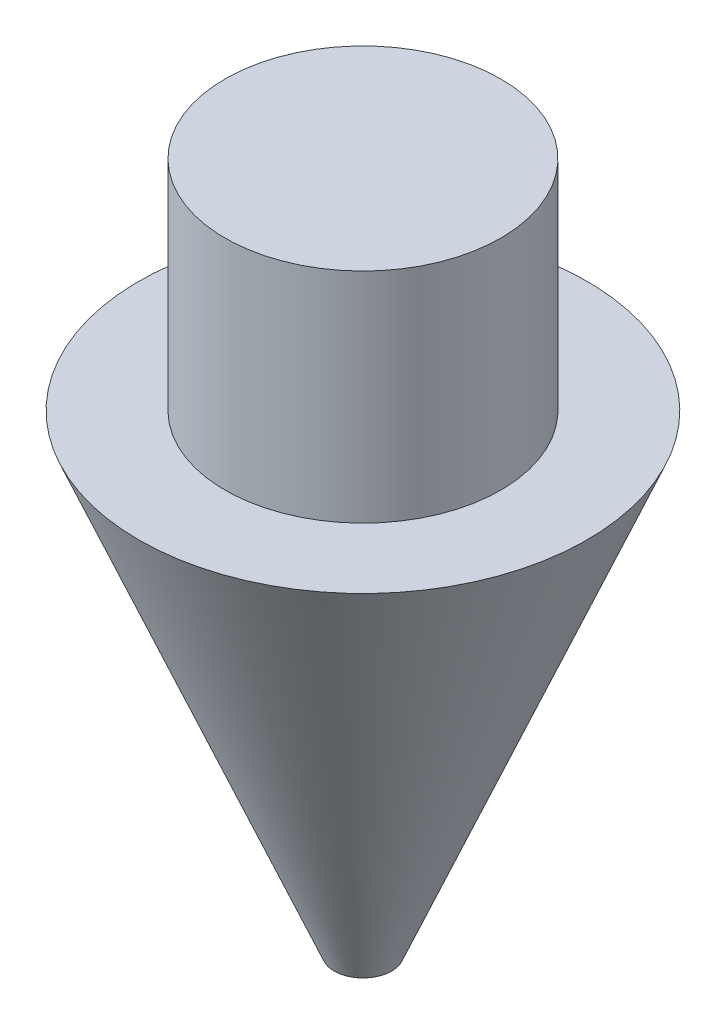
ISO-10303-21;
HEADER;
FILE_DESCRIPTION(('STEP AP214'),'2;1');
FILE_NAME('part.step','',(''),(''),'','','');
FILE_SCHEMA(('AUTOMOTIVE_DESIGN { 1 0 10303 214 1 1 1 1 }'));
ENDSEC;
DATA;
#1=APPLICATION_CONTEXT('core data for automotive mechanical design processes');
#2=APPLICATION_PROTOCOL_DEFINITION('international standard','automotive_design',2000,#1);
#3=PRODUCT_CONTEXT('',#1,'mechanical');
#4=PRODUCT('Part','Part','',(#3));
#5=PRODUCT_RELATED_PRODUCT_CATEGORY('part','',(#4));
#6=PRODUCT_DEFINITION_FORMATION('','',#4);
#7=PRODUCT_DEFINITION_CONTEXT('part definition',#1,'design');
#8=PRODUCT_DEFINITION('design','',#6,#7);
#9=PRODUCT_DEFINITION_SHAPE('','',#8);
#10=(LENGTH_UNIT() NAMED_UNIT(*) SI_UNIT(.MILLI.,.METRE.));
#11=(NAMED_UNIT(*) PLANE_ANGLE_UNIT() SI_UNIT($,.RADIAN.));
#12=(NAMED_UNIT(*) SI_UNIT($,.STERADIAN.) SOLID_ANGLE_UNIT());
#13=UNCERTAINTY_MEASURE_WITH_UNIT(LENGTH_MEASURE(1.E-05),#10,'distance_accuracy_value','');
#14=(GEOMETRIC_REPRESENTATION_CONTEXT(3) GLOBAL_UNCERTAINTY_ASSIGNED_CONTEXT((#13)) GLOBAL_UNIT_ASSIGNED_CONTEXT((#10,
#11,#12)) REPRESENTATION_CONTEXT('',''));
#15=CARTESIAN_POINT('',(0.,0.,0.));
#16=DIRECTION('',(0.,0.,1.));
#17=DIRECTION('',(1.,0.,0.));
#18=AXIS2_PLACEMENT_3D('',#15,#16,#17);
#19=CARTESIAN_POINT('',(0.,0.,0.));
#20=DIRECTION('',(0.,1.,0.));
#21=DIRECTION('',(0.,0.,1.));
#22=AXIS2_PLACEMENT_3D('',#19,#20,#21);
#23=PLANE('',#22);
#24=CARTESIAN_POINT('',(0.,0.,0.));
#25=DIRECTION('',(0.,-1.,0.));
#26=DIRECTION('',(0.,0.,-1.));
#27=AXIS2_PLACEMENT_3D('',#24,#25,#26);
#28=CIRCLE('',#27,2.4);
#29=CARTESIAN_POINT('',(0.,0.,-2.4));
#30=VERTEX_POINT('',#29);
#31=EDGE_CURVE('E10',#30,#30,#28,.T.);
#32=ORIENTED_EDGE('',*,*,#31,.F.);
#33=EDGE_LOOP('',(#32));
#34=FACE_BOUND('',#33,.T.);
#35=ADVANCED_FACE('F37',(#34),#23,.T.);
#36=CARTESIAN_POINT('',(0.,-12.,0.));
#37=DIRECTION('',(0.,-1.,0.));
#38=DIRECTION('',(0.,0.,-1.));
#39=AXIS2_PLACEMENT_3D('',#36,#37,#38);
#40=CYLINDRICAL_SURFACE('',#39,2.4);
#41=ORIENTED_EDGE('',*,*,#31,.T.);
#42=EDGE_LOOP('',(#41));
#43=FACE_BOUND('',#42,.T.);
#44=CARTESIAN_POINT('',(0.,-3.8,0.));
#45=DIRECTION('',(0.,-1.,0.));
#46=DIRECTION('',(0.,0.,-1.));
#47=AXIS2_PLACEMENT_3D('',#44,#45,#46);
#48=CIRCLE('',#47,2.4);
#49=CARTESIAN_POINT('',(0.,-3.8,-2.4));
#50=VERTEX_POINT('',#49);
#51=EDGE_CURVE('E43',#50,#50,#48,.T.);
#52=ORIENTED_EDGE('',*,*,#51,.F.);
#53=EDGE_LOOP('',(#52));
#54=FACE_BOUND('',#53,.T.);
#55=ADVANCED_FACE('F69',(#43,#54),#40,.T.);
#56=CARTESIAN_POINT('',(2.4,-3.8,0.));
#57=DIRECTION('',(0.,1.,0.));
#58=DIRECTION('',(0.,0.,1.));
#59=AXIS2_PLACEMENT_3D('',#56,#57,#58);
#60=PLANE('',#59);
#61=ORIENTED_EDGE('',*,*,#51,.T.);
#62=EDGE_LOOP('',(#61));
#63=FACE_BOUND('',#62,.T.);
#64=CARTESIAN_POINT('',(0.,-3.8,0.));
#65=DIRECTION('',(0.,-1.,0.));
#66=DIRECTION('',(0.,0.,-1.));
#67=AXIS2_PLACEMENT_3D('',#64,#65,#66);
#68=CIRCLE('',#67,3.9);
#69=CARTESIAN_POINT('',(0.,-3.8,3.9));
#70=VERTEX_POINT('',#69);
#71=EDGE_CURVE('E47',#70,#70,#68,.T.);
#72=ORIENTED_EDGE('',*,*,#71,.F.);
#73=EDGE_LOOP('',(#72));
#74=FACE_BOUND('',#73,.T.);
#75=ADVANCED_FACE('F61',(#63,#74),#60,.T.);
#76=CARTESIAN_POINT('',(0.,-12.,0.));
#77=DIRECTION('',(0.,1.,0.));
#78=DIRECTION('',(0.,0.,1.));
#79=AXIS2_PLACEMENT_3D('',#76,#77,#78);
#80=CONICAL_SURFACE('',#79,0.5,0.393058019181932);
#81=CARTESIAN_POINT('',(0.,-12.,0.));
#82=DIRECTION('',(0.,-1.,0.));
#83=DIRECTION('',(0.,0.,-1.));
#84=AXIS2_PLACEMENT_3D('',#81,#82,#83);
#85=CIRCLE('',#84,0.5);
#86=CARTESIAN_POINT('',(0.,-12.,0.5));
#87=VERTEX_POINT('',#86);
#88=EDGE_CURVE('E51',#87,#87,#85,.T.);
#89=CARTESIAN_POINT('',(0.,-3.8,3.9));
#90=CARTESIAN_POINT('',(0.,-3.88541666666666,3.86458333333333));
#91=CARTESIAN_POINT('',(0.,-3.97083333333333,3.82916666666667));
#92=CARTESIAN_POINT('',(0.,-4.14166666666666,3.75833333333333));
#93=CARTESIAN_POINT('',(0.,-4.22708333333333,3.72291666666667));
#94=CARTESIAN_POINT('',(0.,-4.39791666666666,3.65208333333333));
#95=CARTESIAN_POINT('',(0.,-4.48333333333333,3.61666666666667));
#96=CARTESIAN_POINT('',(0.,-4.65416666666667,3.54583333333333));
#97=CARTESIAN_POINT('',(0.,-4.73958333333333,3.51041666666667));
#98=CARTESIAN_POINT('',(0.,-4.91041666666666,3.43958333333333));
#99=CARTESIAN_POINT('',(0.,-4.99583333333333,3.40416666666667));
#100=CARTESIAN_POINT('',(0.,-5.16666666666667,3.33333333333333));
#101=CARTESIAN_POINT('',(0.,-5.25208333333333,3.29791666666667));
#102=CARTESIAN_POINT('',(0.,-5.42291666666667,3.22708333333333));
#103=CARTESIAN_POINT('',(0.,-5.50833333333333,3.19166666666667));
#104=CARTESIAN_POINT('',(0.,-5.67916666666666,3.12083333333333));
#105=CARTESIAN_POINT('',(0.,-5.76458333333333,3.08541666666667));
#106=CARTESIAN_POINT('',(0.,-5.93541666666667,3.01458333333333));
#107=CARTESIAN_POINT('',(0.,-6.02083333333333,2.97916666666667));
#108=CARTESIAN_POINT('',(0.,-6.19166666666667,2.90833333333333));
#109=CARTESIAN_POINT('',(0.,-6.27708333333333,2.87291666666667));
#110=CARTESIAN_POINT('',(0.,-6.44791666666667,2.80208333333333));
#111=CARTESIAN_POINT('',(0.,-6.53333333333333,2.76666666666667));
#112=CARTESIAN_POINT('',(0.,-6.70416666666667,2.69583333333333));
#113=CARTESIAN_POINT('',(0.,-6.78958333333333,2.66041666666667));
#114=CARTESIAN_POINT('',(0.,-6.96041666666667,2.58958333333333));
#115=CARTESIAN_POINT('',(0.,-7.04583333333333,2.55416666666667));
#116=CARTESIAN_POINT('',(0.,-7.21666666666667,2.48333333333333));
#117=CARTESIAN_POINT('',(0.,-7.30208333333333,2.44791666666667));
#118=CARTESIAN_POINT('',(0.,-7.47291666666667,2.37708333333333));
#119=CARTESIAN_POINT('',(0.,-7.55833333333333,2.34166666666667));
#120=CARTESIAN_POINT('',(0.,-7.72916666666667,2.27083333333333));
#121=CARTESIAN_POINT('',(0.,-7.81458333333333,2.23541666666667));
#122=CARTESIAN_POINT('',(0.,-7.98541666666667,2.16458333333333));
#123=CARTESIAN_POINT('',(0.,-8.07083333333333,2.12916666666667));
#124=CARTESIAN_POINT('',(0.,-8.24166666666667,2.05833333333333));
#125=CARTESIAN_POINT('',(0.,-8.32708333333333,2.02291666666667));
#126=CARTESIAN_POINT('',(0.,-8.49791666666667,1.95208333333333));
#127=CARTESIAN_POINT('',(0.,-8.58333333333333,1.91666666666667));
#128=CARTESIAN_POINT('',(0.,-8.75416666666666,1.84583333333333));
#129=CARTESIAN_POINT('',(0.,-8.83958333333333,1.81041666666667));
#130=CARTESIAN_POINT('',(0.,-9.01041666666666,1.73958333333333));
#131=CARTESIAN_POINT('',(0.,-9.09583333333333,1.70416666666667));
#132=CARTESIAN_POINT('',(0.,-9.26666666666667,1.63333333333333));
#133=CARTESIAN_POINT('',(0.,-9.35208333333333,1.59791666666667));
#134=CARTESIAN_POINT('',(0.,-9.52291666666667,1.52708333333333));
#135=CARTESIAN_POINT('',(0.,-9.60833333333333,1.49166666666667));
#136=CARTESIAN_POINT('',(0.,-9.77916666666667,1.42083333333333));
#137=CARTESIAN_POINT('',(0.,-9.86458333333333,1.38541666666667));
#138=CARTESIAN_POINT('',(0.,-10.0354166666667,1.31458333333333));
#139=CARTESIAN_POINT('',(0.,-10.1208333333333,1.27916666666667));
#140=CARTESIAN_POINT('',(0.,-10.2916666666667,1.20833333333333));
#141=CARTESIAN_POINT('',(0.,-10.3770833333333,1.17291666666667));
#142=CARTESIAN_POINT('',(0.,-10.5479166666667,1.10208333333333));
#143=CARTESIAN_POINT('',(0.,-10.6333333333333,1.06666666666667));
#144=CARTESIAN_POINT('',(0.,-10.8041666666667,0.995833333333333));
#145=CARTESIAN_POINT('',(0.,-10.8895833333333,0.960416666666667));
#146=CARTESIAN_POINT('',(0.,-11.0604166666667,0.889583333333333));
#147=CARTESIAN_POINT('',(0.,-11.1458333333333,0.854166666666667));
#148=CARTESIAN_POINT('',(0.,-11.3166666666667,0.783333333333333));
#149=CARTESIAN_POINT('',(0.,-11.4020833333333,0.747916666666667));
#150=CARTESIAN_POINT('',(0.,-11.5729166666667,0.677083333333333));
#151=CARTESIAN_POINT('',(0.,-11.6583333333333,0.641666666666667));
#152=CARTESIAN_POINT('',(0.,-11.8291666666667,0.570833333333333));
#153=CARTESIAN_POINT('',(0.,-11.9145833333333,0.535416666666666));
#154=CARTESIAN_POINT('',(0.,-12.,0.5));
#155=B_SPLINE_CURVE_WITH_KNOTS('',3,(#89,#90,#91,#92,#93,#94,#95,#96,#97,#98,#99,#100,#101,#102,
#103,#104,#105,#106,#107,#108,#109,#110,#111,#112,#113,#114,#115,#116,#117,#118,#119,#120,#121,
#122,#123,#124,#125,#126,#127,#128,#129,#130,#131,#132,#133,#134,#135,#136,#137,#138,#139,#140,
#141,#142,#143,#144,#145,#146,#147,#148,#149,#150,#151,#152,#153,#154),.UNSPECIFIED.,.F.,.F.,(4,
2,2,2,2,2,2,2,2,2,2,2,2,2,2,2,2,2,2,2,2,2,2,2,2,2,2,2,2,2,2,2,4),(0.,0.277404262764651,
0.554808525529303,0.832212788293956,1.10961705105861,1.38702131382326,1.66442557658791,
1.94182983935256,2.21923410211722,2.49663836488187,2.77404262764652,3.05144689041117,
3.32885115317582,3.60625541594047,3.88365967870513,4.16106394146978,4.43846820423443,
4.71587246699908,4.99327672976374,5.27068099252839,5.54808525529304,5.82548951805769,
6.10289378082234,6.38029804358699,6.65770230635165,6.9351065691163,7.21251083188095,
7.4899150946456,7.76731935741025,8.0447236201749,8.32212788293956,8.59953214570421,
8.87693640846886),.UNSPECIFIED.);
#156=EDGE_CURVE('BSEAM59',#70,#87,#155,.T.);
#157=ORIENTED_EDGE('',*,*,#71,.T.);
#158=ORIENTED_EDGE('',*,*,#88,.F.);
#159=ORIENTED_EDGE('',*,*,#156,.T.);
#160=ORIENTED_EDGE('',*,*,#156,.F.);
#161=EDGE_LOOP('',(#157,#159,#158,#160));
#162=FACE_BOUND('',#161,.T.);
#163=ADVANCED_FACE('F59',(#162),#80,.T.);
#164=CARTESIAN_POINT('',(0.,-12.,0.));
#165=DIRECTION('',(0.,-1.,0.));
#166=DIRECTION('',(0.,0.,-1.));
#167=AXIS2_PLACEMENT_3D('',#164,#165,#166);
#168=PLANE('',#167);
#169=ORIENTED_EDGE('',*,*,#88,.T.);
#170=EDGE_LOOP('',(#169));
#171=FACE_BOUND('',#170,.T.);
#172=ADVANCED_FACE('F57',(#171),#168,.T.);
#173=CLOSED_SHELL('',(#35,#55,#75,#163,#172));
#174=MANIFOLD_SOLID_BREP('B2',#173);
#175=ADVANCED_BREP_SHAPE_REPRESENTATION('',(#18,#174),#14);
#176=SHAPE_DEFINITION_REPRESENTATION(#9,#175);
ENDSEC;
END-ISO-10303-21;
